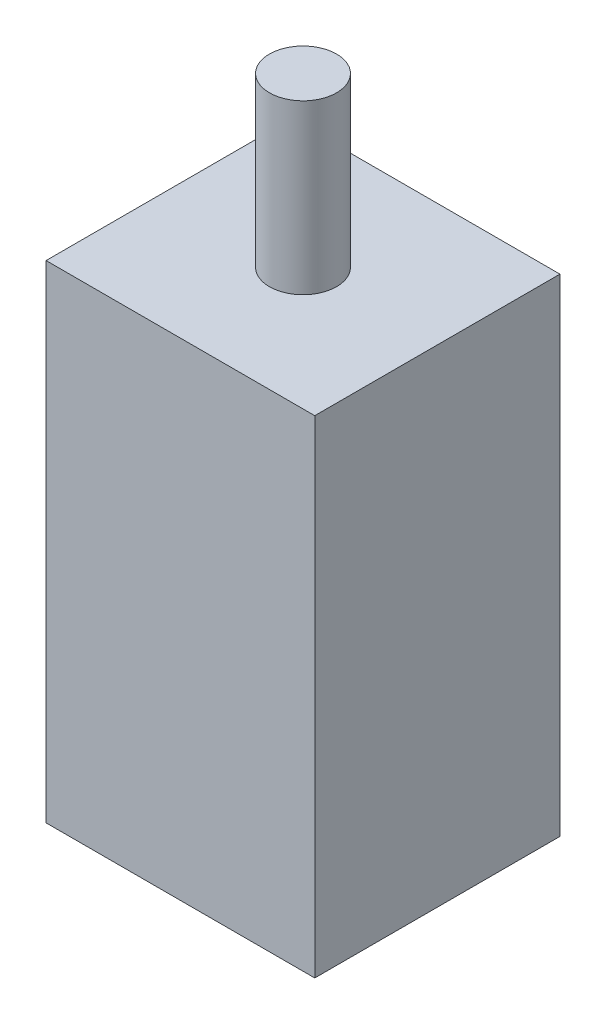
ISO-10303-21;
HEADER;
FILE_DESCRIPTION(('STEP AP214'),'2;1');
FILE_NAME('part.step','',(''),(''),'','','');
FILE_SCHEMA(('AUTOMOTIVE_DESIGN { 1 0 10303 214 1 1 1 1 }'));
ENDSEC;
DATA;
#1=APPLICATION_CONTEXT('core data for automotive mechanical design processes');
#2=APPLICATION_PROTOCOL_DEFINITION('international standard','automotive_design',2000,#1);
#3=PRODUCT_CONTEXT('',#1,'mechanical');
#4=PRODUCT('Part','Part','',(#3));
#5=PRODUCT_RELATED_PRODUCT_CATEGORY('part','',(#4));
#6=PRODUCT_DEFINITION_FORMATION('','',#4);
#7=PRODUCT_DEFINITION_CONTEXT('part definition',#1,'design');
#8=PRODUCT_DEFINITION('design','',#6,#7);
#9=PRODUCT_DEFINITION_SHAPE('','',#8);
#10=(LENGTH_UNIT() NAMED_UNIT(*) SI_UNIT(.MILLI.,.METRE.));
#11=(NAMED_UNIT(*) PLANE_ANGLE_UNIT() SI_UNIT($,.RADIAN.));
#12=(NAMED_UNIT(*) SI_UNIT($,.STERADIAN.) SOLID_ANGLE_UNIT());
#13=UNCERTAINTY_MEASURE_WITH_UNIT(LENGTH_MEASURE(1.E-05),#10,'distance_accuracy_value','');
#14=(GEOMETRIC_REPRESENTATION_CONTEXT(3) GLOBAL_UNCERTAINTY_ASSIGNED_CONTEXT((#13)) GLOBAL_UNIT_ASSIGNED_CONTEXT((#10,
#11,#12)) REPRESENTATION_CONTEXT('',''));
#15=CARTESIAN_POINT('',(0.,0.,0.));
#16=DIRECTION('',(0.,0.,1.));
#17=DIRECTION('',(1.,0.,0.));
#18=AXIS2_PLACEMENT_3D('',#15,#16,#17);
#19=CARTESIAN_POINT('',(-7.18518518518518,29.,3.2962962962963));
#20=DIRECTION('',(0.,0.,-1.));
#21=DIRECTION('',(-1.,0.,0.));
#22=AXIS2_PLACEMENT_3D('',#19,#20,#21);
#23=PLANE('',#22);
#24=DIRECTION('',(1.,0.,0.));
#25=VECTOR('',#24,1.);
#26=CARTESIAN_POINT('',(-7.18518518518518,0.,3.2962962962963));
#27=LINE('',#26,#25);
#28=CARTESIAN_POINT('',(-7.18518518518518,0.,3.2962962962963));
#29=VERTEX_POINT('',#28);
#30=CARTESIAN_POINT('',(8.81481481481482,0.,3.2962962962963));
#31=VERTEX_POINT('',#30);
#32=EDGE_CURVE('E115',#29,#31,#27,.T.);
#33=ORIENTED_EDGE('',*,*,#32,.T.);
#34=DIRECTION('',(0.,-1.,0.));
#35=VECTOR('',#34,1.);
#36=CARTESIAN_POINT('',(8.81481481481482,29.,3.2962962962963));
#37=LINE('',#36,#35);
#38=CARTESIAN_POINT('',(8.81481481481482,29.,3.2962962962963));
#39=VERTEX_POINT('',#38);
#40=EDGE_CURVE('E48',#39,#31,#37,.T.);
#41=ORIENTED_EDGE('',*,*,#40,.F.);
#42=DIRECTION('',(1.,0.,0.));
#43=VECTOR('',#42,1.);
#44=CARTESIAN_POINT('',(-7.18518518518518,29.,3.2962962962963));
#45=LINE('',#44,#43);
#46=CARTESIAN_POINT('',(-7.18518518518518,29.,3.2962962962963));
#47=VERTEX_POINT('',#46);
#48=EDGE_CURVE('E87',#47,#39,#45,.T.);
#49=ORIENTED_EDGE('',*,*,#48,.F.);
#50=DIRECTION('',(0.,-1.,0.));
#51=VECTOR('',#50,1.);
#52=CARTESIAN_POINT('',(-7.18518518518518,29.,3.2962962962963));
#53=LINE('',#52,#51);
#54=EDGE_CURVE('E111',#47,#29,#53,.T.);
#55=ORIENTED_EDGE('',*,*,#54,.T.);
#56=EDGE_LOOP('',(#33,#41,#49,#55));
#57=FACE_BOUND('',#56,.T.);
#58=ADVANCED_FACE('F45',(#57),#23,.F.);
#59=CARTESIAN_POINT('',(8.81481481481482,29.,-11.3037037037037));
#60=DIRECTION('',(1.,0.,0.));
#61=DIRECTION('',(0.,0.,-1.));
#62=AXIS2_PLACEMENT_3D('',#59,#60,#61);
#63=PLANE('',#62);
#64=DIRECTION('',(0.,0.,1.));
#65=VECTOR('',#64,1.);
#66=CARTESIAN_POINT('',(8.81481481481482,0.,-11.3037037037037));
#67=LINE('',#66,#65);
#68=CARTESIAN_POINT('',(8.81481481481482,0.,-11.3037037037037));
#69=VERTEX_POINT('',#68);
#70=EDGE_CURVE('E97',#69,#31,#67,.T.);
#71=ORIENTED_EDGE('',*,*,#70,.F.);
#72=DIRECTION('',(0.,-1.,0.));
#73=VECTOR('',#72,1.);
#74=CARTESIAN_POINT('',(8.81481481481482,29.,-11.3037037037037));
#75=LINE('',#74,#73);
#76=CARTESIAN_POINT('',(8.81481481481482,29.,-11.3037037037037));
#77=VERTEX_POINT('',#76);
#78=EDGE_CURVE('E93',#77,#69,#75,.T.);
#79=ORIENTED_EDGE('',*,*,#78,.F.);
#80=DIRECTION('',(0.,0.,1.));
#81=VECTOR('',#80,1.);
#82=CARTESIAN_POINT('',(8.81481481481482,29.,-11.3037037037037));
#83=LINE('',#82,#81);
#84=EDGE_CURVE('E95',#77,#39,#83,.T.);
#85=ORIENTED_EDGE('',*,*,#84,.T.);
#86=ORIENTED_EDGE('',*,*,#40,.T.);
#87=EDGE_LOOP('',(#71,#79,#85,#86));
#88=FACE_BOUND('',#87,.T.);
#89=ADVANCED_FACE('F94',(#88),#63,.T.);
#90=CARTESIAN_POINT('',(-7.18518518518519,29.,-11.3037037037037));
#91=DIRECTION('',(0.,0.,-1.));
#92=DIRECTION('',(-1.,0.,0.));
#93=AXIS2_PLACEMENT_3D('',#90,#91,#92);
#94=PLANE('',#93);
#95=DIRECTION('',(1.,0.,0.));
#96=VECTOR('',#95,1.);
#97=CARTESIAN_POINT('',(-7.18518518518519,0.,-11.3037037037037));
#98=LINE('',#97,#96);
#99=CARTESIAN_POINT('',(-7.18518518518519,0.,-11.3037037037037));
#100=VERTEX_POINT('',#99);
#101=EDGE_CURVE('E122',#100,#69,#98,.T.);
#102=ORIENTED_EDGE('',*,*,#101,.F.);
#103=DIRECTION('',(0.,-1.,0.));
#104=VECTOR('',#103,1.);
#105=CARTESIAN_POINT('',(-7.18518518518519,29.,-11.3037037037037));
#106=LINE('',#105,#104);
#107=CARTESIAN_POINT('',(-7.18518518518519,29.,-11.3037037037037));
#108=VERTEX_POINT('',#107);
#109=EDGE_CURVE('E79',#108,#100,#106,.T.);
#110=ORIENTED_EDGE('',*,*,#109,.F.);
#111=DIRECTION('',(1.,0.,0.));
#112=VECTOR('',#111,1.);
#113=CARTESIAN_POINT('',(-7.18518518518519,29.,-11.3037037037037));
#114=LINE('',#113,#112);
#115=EDGE_CURVE('E104',#108,#77,#114,.T.);
#116=ORIENTED_EDGE('',*,*,#115,.T.);
#117=ORIENTED_EDGE('',*,*,#78,.T.);
#118=EDGE_LOOP('',(#102,#110,#116,#117));
#119=FACE_BOUND('',#118,.T.);
#120=ADVANCED_FACE('F107',(#119),#94,.T.);
#121=CARTESIAN_POINT('',(-7.18518518518519,29.,-11.3037037037037));
#122=DIRECTION('',(1.,0.,0.));
#123=DIRECTION('',(0.,0.,-1.));
#124=AXIS2_PLACEMENT_3D('',#121,#122,#123);
#125=PLANE('',#124);
#126=DIRECTION('',(0.,0.,1.));
#127=VECTOR('',#126,1.);
#128=CARTESIAN_POINT('',(-7.18518518518519,0.,-11.3037037037037));
#129=LINE('',#128,#127);
#130=EDGE_CURVE('E82',#100,#29,#129,.T.);
#131=ORIENTED_EDGE('',*,*,#130,.T.);
#132=ORIENTED_EDGE('',*,*,#54,.F.);
#133=DIRECTION('',(0.,0.,1.));
#134=VECTOR('',#133,1.);
#135=CARTESIAN_POINT('',(-7.18518518518519,29.,-11.3037037037037));
#136=LINE('',#135,#134);
#137=EDGE_CURVE('E63',#108,#47,#136,.T.);
#138=ORIENTED_EDGE('',*,*,#137,.F.);
#139=ORIENTED_EDGE('',*,*,#109,.T.);
#140=EDGE_LOOP('',(#131,#132,#138,#139));
#141=FACE_BOUND('',#140,.T.);
#142=ADVANCED_FACE('F146',(#141),#125,.F.);
#143=CARTESIAN_POINT('',(0.,29.,0.));
#144=DIRECTION('',(0.,-1.,0.));
#145=DIRECTION('',(0.,0.,-1.));
#146=AXIS2_PLACEMENT_3D('',#143,#144,#145);
#147=PLANE('',#146);
#148=CARTESIAN_POINT('',(0.814814814814816,29.,-4.0037037037037));
#149=DIRECTION('',(0.,1.,0.));
#150=DIRECTION('',(0.,0.,1.));
#151=AXIS2_PLACEMENT_3D('',#148,#149,#150);
#152=CIRCLE('',#151,2.);
#153=CARTESIAN_POINT('',(0.814814814814816,29.,-2.0037037037037));
#154=VERTEX_POINT('',#153);
#155=EDGE_CURVE('E11',#154,#154,#152,.T.);
#156=ORIENTED_EDGE('',*,*,#155,.F.);
#157=EDGE_LOOP('',(#156));
#158=FACE_BOUND('',#157,.T.);
#159=ORIENTED_EDGE('',*,*,#48,.T.);
#160=ORIENTED_EDGE('',*,*,#84,.F.);
#161=ORIENTED_EDGE('',*,*,#115,.F.);
#162=ORIENTED_EDGE('',*,*,#137,.T.);
#163=EDGE_LOOP('',(#159,#160,#161,#162));
#164=FACE_BOUND('',#163,.T.);
#165=ADVANCED_FACE('F103',(#158,#164),#147,.F.);
#166=CARTESIAN_POINT('',(0.,0.,0.));
#167=DIRECTION('',(0.,-1.,0.));
#168=DIRECTION('',(0.,0.,-1.));
#169=AXIS2_PLACEMENT_3D('',#166,#167,#168);
#170=PLANE('',#169);
#171=ORIENTED_EDGE('',*,*,#32,.F.);
#172=ORIENTED_EDGE('',*,*,#130,.F.);
#173=ORIENTED_EDGE('',*,*,#101,.T.);
#174=ORIENTED_EDGE('',*,*,#70,.T.);
#175=EDGE_LOOP('',(#171,#172,#173,#174));
#176=FACE_BOUND('',#175,.T.);
#177=ADVANCED_FACE('F134',(#176),#170,.T.);
#178=CARTESIAN_POINT('',(0.814814814814816,39.,-4.0037037037037));
#179=DIRECTION('',(0.,-1.,0.));
#180=DIRECTION('',(0.,0.,-1.));
#181=AXIS2_PLACEMENT_3D('',#178,#179,#180);
#182=CYLINDRICAL_SURFACE('',#181,2.);
#183=CARTESIAN_POINT('',(0.814814814814816,39.,-4.0037037037037));
#184=DIRECTION('',(0.,1.,0.));
#185=DIRECTION('',(0.,0.,1.));
#186=AXIS2_PLACEMENT_3D('',#183,#184,#185);
#187=CIRCLE('',#186,2.);
#188=CARTESIAN_POINT('',(0.814814814814816,39.,-2.0037037037037));
#189=VERTEX_POINT('',#188);
#190=EDGE_CURVE('E119',#189,#189,#187,.T.);
#191=ORIENTED_EDGE('',*,*,#190,.F.);
#192=EDGE_LOOP('',(#191));
#193=FACE_BOUND('',#192,.T.);
#194=ORIENTED_EDGE('',*,*,#155,.T.);
#195=EDGE_LOOP('',(#194));
#196=FACE_BOUND('',#195,.T.);
#197=ADVANCED_FACE('F136',(#193,#196),#182,.T.);
#198=CARTESIAN_POINT('',(0.814814814814816,39.,-4.0037037037037));
#199=DIRECTION('',(0.,1.,0.));
#200=DIRECTION('',(0.,0.,1.));
#201=AXIS2_PLACEMENT_3D('',#198,#199,#200);
#202=PLANE('',#201);
#203=ORIENTED_EDGE('',*,*,#190,.T.);
#204=EDGE_LOOP('',(#203));
#205=FACE_BOUND('',#204,.T.);
#206=ADVANCED_FACE('F143',(#205),#202,.T.);
#207=CLOSED_SHELL('',(#58,#89,#120,#142,#165,#177,#197,#206));
#208=MANIFOLD_SOLID_BREP('B2',#207);
#209=ADVANCED_BREP_SHAPE_REPRESENTATION('',(#18,#208),#14);
#210=SHAPE_DEFINITION_REPRESENTATION(#9,#209);
ENDSEC;
END-ISO-10303-21;
